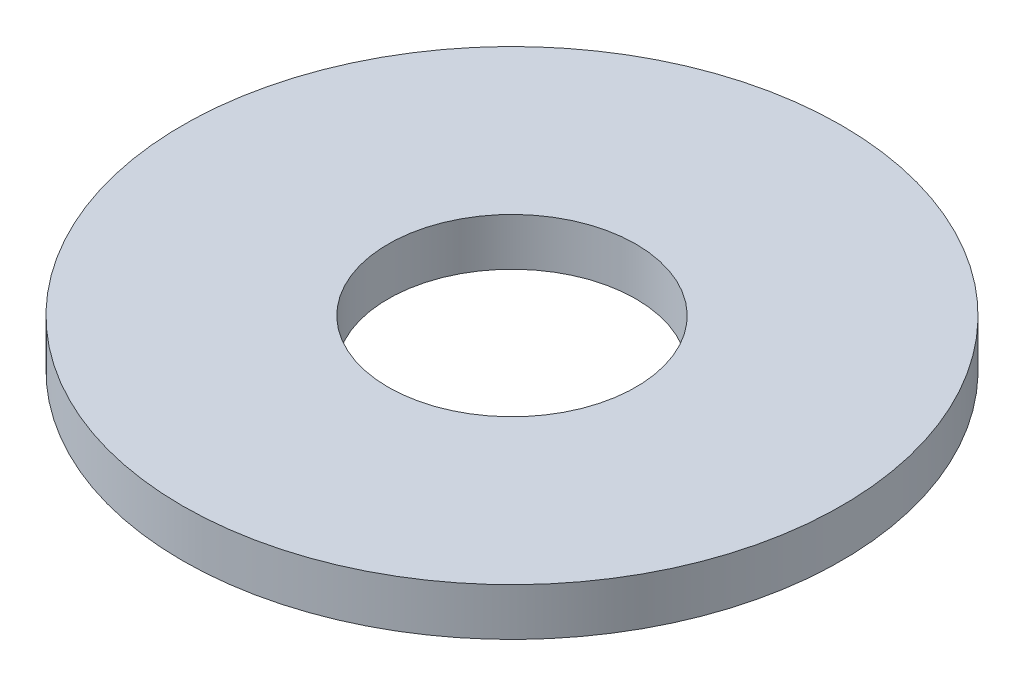
ISO-10303-21;
HEADER;
FILE_DESCRIPTION(('STEP AP214'),'2;1');
FILE_NAME('part.step','',(''),(''),'','','');
FILE_SCHEMA(('AUTOMOTIVE_DESIGN { 1 0 10303 214 1 1 1 1 }'));
ENDSEC;
DATA;
#1=APPLICATION_CONTEXT('core data for automotive mechanical design processes');
#2=APPLICATION_PROTOCOL_DEFINITION('international standard','automotive_design',2000,#1);
#3=PRODUCT_CONTEXT('',#1,'mechanical');
#4=PRODUCT('Part','Part','',(#3));
#5=PRODUCT_RELATED_PRODUCT_CATEGORY('part','',(#4));
#6=PRODUCT_DEFINITION_FORMATION('','',#4);
#7=PRODUCT_DEFINITION_CONTEXT('part definition',#1,'design');
#8=PRODUCT_DEFINITION('design','',#6,#7);
#9=PRODUCT_DEFINITION_SHAPE('','',#8);
#10=(LENGTH_UNIT() NAMED_UNIT(*) SI_UNIT(.MILLI.,.METRE.));
#11=(NAMED_UNIT(*) PLANE_ANGLE_UNIT() SI_UNIT($,.RADIAN.));
#12=(NAMED_UNIT(*) SI_UNIT($,.STERADIAN.) SOLID_ANGLE_UNIT());
#13=UNCERTAINTY_MEASURE_WITH_UNIT(LENGTH_MEASURE(1.E-05),#10,'distance_accuracy_value','');
#14=(GEOMETRIC_REPRESENTATION_CONTEXT(3) GLOBAL_UNCERTAINTY_ASSIGNED_CONTEXT((#13)) GLOBAL_UNIT_ASSIGNED_CONTEXT((#10,
#11,#12)) REPRESENTATION_CONTEXT('',''));
#15=CARTESIAN_POINT('',(0.,0.,0.));
#16=DIRECTION('',(0.,0.,1.));
#17=DIRECTION('',(1.,0.,0.));
#18=AXIS2_PLACEMENT_3D('',#15,#16,#17);
#19=CARTESIAN_POINT('',(0.,0.4572,0.));
#20=DIRECTION('',(0.,-1.,0.));
#21=DIRECTION('',(0.,0.,-1.));
#22=AXIS2_PLACEMENT_3D('',#19,#20,#21);
#23=CYLINDRICAL_SURFACE('',#22,3.175);
#24=CARTESIAN_POINT('',(0.,0.4572,0.));
#25=DIRECTION('',(0.,1.,0.));
#26=DIRECTION('',(0.,0.,1.));
#27=AXIS2_PLACEMENT_3D('',#24,#25,#26);
#28=CIRCLE('',#27,3.175);
#29=CARTESIAN_POINT('',(0.,0.4572,3.175));
#30=VERTEX_POINT('',#29);
#31=EDGE_CURVE('E10',#30,#30,#28,.T.);
#32=ORIENTED_EDGE('',*,*,#31,.F.);
#33=EDGE_LOOP('',(#32));
#34=FACE_BOUND('',#33,.T.);
#35=CARTESIAN_POINT('',(0.,0.,0.));
#36=DIRECTION('',(0.,1.,0.));
#37=DIRECTION('',(0.,0.,1.));
#38=AXIS2_PLACEMENT_3D('',#35,#36,#37);
#39=CIRCLE('',#38,3.175);
#40=CARTESIAN_POINT('',(0.,0.,3.175));
#41=VERTEX_POINT('',#40);
#42=EDGE_CURVE('E32',#41,#41,#39,.T.);
#43=ORIENTED_EDGE('',*,*,#42,.T.);
#44=EDGE_LOOP('',(#43));
#45=FACE_BOUND('',#44,.T.);
#46=ADVANCED_FACE('F29',(#34,#45),#23,.T.);
#47=CARTESIAN_POINT('',(0.,0.4572,0.));
#48=DIRECTION('',(0.,1.,0.));
#49=DIRECTION('',(0.,0.,1.));
#50=AXIS2_PLACEMENT_3D('',#47,#48,#49);
#51=PLANE('',#50);
#52=CARTESIAN_POINT('',(0.,0.4572,0.));
#53=DIRECTION('',(0.,1.,0.));
#54=DIRECTION('',(0.,0.,1.));
#55=AXIS2_PLACEMENT_3D('',#52,#53,#54);
#56=CIRCLE('',#55,1.1938);
#57=CARTESIAN_POINT('',(0.,0.4572,1.1938));
#58=VERTEX_POINT('',#57);
#59=EDGE_CURVE('E41',#58,#58,#56,.T.);
#60=ORIENTED_EDGE('',*,*,#59,.F.);
#61=EDGE_LOOP('',(#60));
#62=FACE_BOUND('',#61,.T.);
#63=ORIENTED_EDGE('',*,*,#31,.T.);
#64=EDGE_LOOP('',(#63));
#65=FACE_BOUND('',#64,.T.);
#66=ADVANCED_FACE('F56',(#62,#65),#51,.T.);
#67=CARTESIAN_POINT('',(0.,0.,0.));
#68=DIRECTION('',(0.,1.,0.));
#69=DIRECTION('',(0.,0.,1.));
#70=AXIS2_PLACEMENT_3D('',#67,#68,#69);
#71=PLANE('',#70);
#72=CARTESIAN_POINT('',(0.,0.,0.));
#73=DIRECTION('',(0.,1.,0.));
#74=DIRECTION('',(0.,0.,1.));
#75=AXIS2_PLACEMENT_3D('',#72,#73,#74);
#76=CIRCLE('',#75,1.1938);
#77=CARTESIAN_POINT('',(0.,0.,1.1938));
#78=VERTEX_POINT('',#77);
#79=EDGE_CURVE('E39',#78,#78,#76,.T.);
#80=ORIENTED_EDGE('',*,*,#79,.T.);
#81=EDGE_LOOP('',(#80));
#82=FACE_BOUND('',#81,.T.);
#83=ORIENTED_EDGE('',*,*,#42,.F.);
#84=EDGE_LOOP('',(#83));
#85=FACE_BOUND('',#84,.T.);
#86=ADVANCED_FACE('F47',(#82,#85),#71,.F.);
#87=CARTESIAN_POINT('',(0.,0.,0.));
#88=DIRECTION('',(0.,1.,0.));
#89=DIRECTION('',(0.,0.,1.));
#90=AXIS2_PLACEMENT_3D('',#87,#88,#89);
#91=CYLINDRICAL_SURFACE('',#90,1.1938);
#92=ORIENTED_EDGE('',*,*,#79,.F.);
#93=EDGE_LOOP('',(#92));
#94=FACE_BOUND('',#93,.T.);
#95=ORIENTED_EDGE('',*,*,#59,.T.);
#96=EDGE_LOOP('',(#95));
#97=FACE_BOUND('',#96,.T.);
#98=ADVANCED_FACE('F50',(#94,#97),#91,.F.);
#99=CLOSED_SHELL('',(#46,#66,#86,#98));
#100=MANIFOLD_SOLID_BREP('B2',#99);
#101=ADVANCED_BREP_SHAPE_REPRESENTATION('',(#18,#100),#14);
#102=SHAPE_DEFINITION_REPRESENTATION(#9,#101);
ENDSEC;
END-ISO-10303-21;
